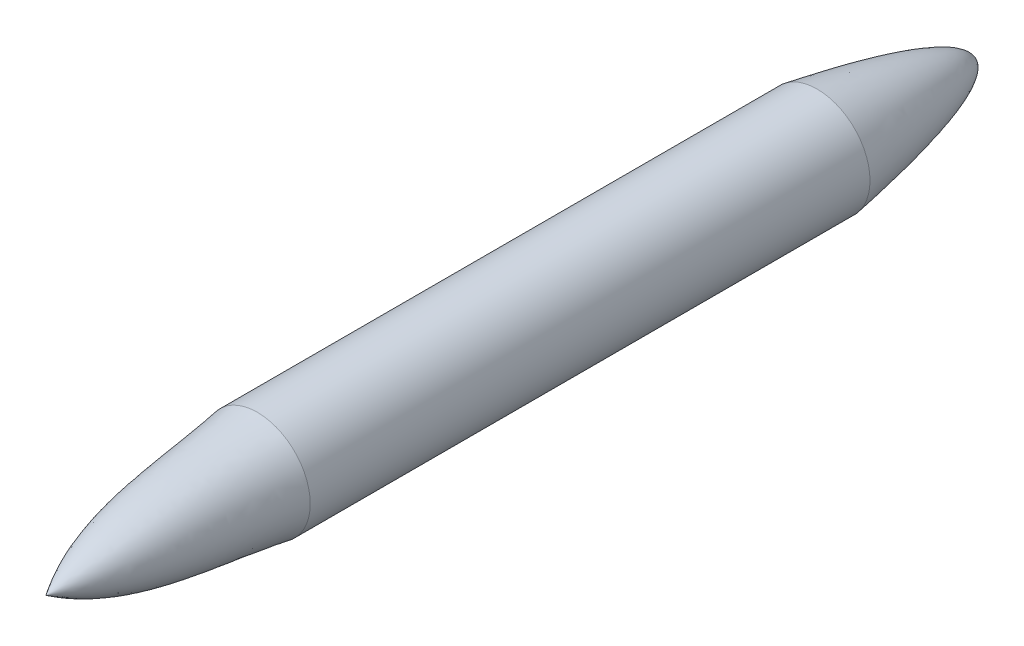
ISO-10303-21;
HEADER;
FILE_DESCRIPTION(('STEP AP214'),'2;1');
FILE_NAME('part.step','',(''),(''),'','','');
FILE_SCHEMA(('AUTOMOTIVE_DESIGN { 1 0 10303 214 1 1 1 1 }'));
ENDSEC;
DATA;
#1=APPLICATION_CONTEXT('core data for automotive mechanical design processes');
#2=APPLICATION_PROTOCOL_DEFINITION('international standard','automotive_design',2000,#1);
#3=PRODUCT_CONTEXT('',#1,'mechanical');
#4=PRODUCT('Part','Part','',(#3));
#5=PRODUCT_RELATED_PRODUCT_CATEGORY('part','',(#4));
#6=PRODUCT_DEFINITION_FORMATION('','',#4);
#7=PRODUCT_DEFINITION_CONTEXT('part definition',#1,'design');
#8=PRODUCT_DEFINITION('design','',#6,#7);
#9=PRODUCT_DEFINITION_SHAPE('','',#8);
#10=(LENGTH_UNIT() NAMED_UNIT(*) SI_UNIT(.MILLI.,.METRE.));
#11=(NAMED_UNIT(*) PLANE_ANGLE_UNIT() SI_UNIT($,.RADIAN.));
#12=(NAMED_UNIT(*) SI_UNIT($,.STERADIAN.) SOLID_ANGLE_UNIT());
#13=UNCERTAINTY_MEASURE_WITH_UNIT(LENGTH_MEASURE(1.E-05),#10,'distance_accuracy_value','');
#14=(GEOMETRIC_REPRESENTATION_CONTEXT(3) GLOBAL_UNCERTAINTY_ASSIGNED_CONTEXT((#13)) GLOBAL_UNIT_ASSIGNED_CONTEXT((#10,
#11,#12)) REPRESENTATION_CONTEXT('',''));
#15=CARTESIAN_POINT('',(0.,0.,0.));
#16=DIRECTION('',(0.,0.,1.));
#17=DIRECTION('',(1.,0.,0.));
#18=AXIS2_PLACEMENT_3D('',#15,#16,#17);
#19=CARTESIAN_POINT('',(9.76480452898376E-13,0.,-17495.52));
#20=CARTESIAN_POINT('',(-996.695999987018,0.,-17495.5199999231));
#21=CARTESIAN_POINT('',(-1993.39200000001,0.,-11595.07968));
#22=B_SPLINE_CURVE_WITH_KNOTS('',2,(#19,#20,#21),.UNSPECIFIED.,.F.,.F.,(3,3),(0.,
0.499999999993487),.UNSPECIFIED.);
#23=CARTESIAN_POINT('',(-1.34825970790097E-12,0.,-17495.52));
#24=DIRECTION('',(0.,0.,1.));
#25=AXIS1_PLACEMENT('',#23,#24);
#26=SURFACE_OF_REVOLUTION('',#22,#25);
#27=CARTESIAN_POINT('',(-1.60926121519527E-12,0.,-11595.07968));
#28=DIRECTION('',(0.,0.,1.));
#29=DIRECTION('',(1.,0.,0.));
#30=AXIS2_PLACEMENT_3D('',#27,#28,#29);
#31=CIRCLE('',#30,1993.392);
#32=CARTESIAN_POINT('',(1993.392,0.,-11595.07968));
#33=VERTEX_POINT('',#32);
#34=EDGE_CURVE('E11',#33,#33,#31,.T.);
#35=ORIENTED_EDGE('',*,*,#34,.F.);
#36=EDGE_LOOP('',(#35));
#37=FACE_BOUND('',#36,.T.);
#38=CARTESIAN_POINT('',(-1.34825970790097E-12,0.,-17495.52));
#39=VERTEX_POINT('',#38);
#40=VERTEX_LOOP('',#39);
#41=FACE_BOUND('',#40,.T.);
#42=ADVANCED_FACE('F36',(#37,#41),#26,.T.);
#43=CARTESIAN_POINT('',(-1.34825970790097E-12,0.,-17495.52));
#44=DIRECTION('',(0.,0.,1.));
#45=DIRECTION('',(1.,0.,0.));
#46=AXIS2_PLACEMENT_3D('',#43,#44,#45);
#47=CYLINDRICAL_SURFACE('',#46,1993.392);
#48=CARTESIAN_POINT('',(-2.54335711298439E-12,0.,9521.952));
#49=DIRECTION('',(0.,0.,1.));
#50=DIRECTION('',(1.,0.,0.));
#51=AXIS2_PLACEMENT_3D('',#48,#49,#50);
#52=CIRCLE('',#51,1993.392);
#53=CARTESIAN_POINT('',(1993.392,0.,9521.952));
#54=VERTEX_POINT('',#53);
#55=EDGE_CURVE('E44',#54,#54,#52,.T.);
#56=ORIENTED_EDGE('',*,*,#55,.F.);
#57=EDGE_LOOP('',(#56));
#58=FACE_BOUND('',#57,.T.);
#59=ORIENTED_EDGE('',*,*,#34,.T.);
#60=EDGE_LOOP('',(#59));
#61=FACE_BOUND('',#60,.T.);
#62=ADVANCED_FACE('F53',(#58,#61),#47,.T.);
#63=CARTESIAN_POINT('',(-1993.392,0.,9521.952));
#64=CARTESIAN_POINT('',(-1540.98996407076,0.,12218.2816316481));
#65=CARTESIAN_POINT('',(-1564.11131680031,0.,15114.5070668162));
#66=CARTESIAN_POINT('',(9.76480452898376E-13,0.,17495.52));
#67=B_SPLINE_CURVE_WITH_KNOTS('',3,(#63,#64,#65,#66),.UNSPECIFIED.,.F.,.F.,(4,4),(0.,1.),.UNSPECIFIED.);
#68=CARTESIAN_POINT('',(-1.34825970790097E-12,0.,-17495.52));
#69=DIRECTION('',(0.,0.,1.));
#70=AXIS1_PLACEMENT('',#68,#69);
#71=SURFACE_OF_REVOLUTION('',#67,#70);
#72=CARTESIAN_POINT('',(2.93690680558273E-12,0.,17495.52));
#73=VERTEX_POINT('',#72);
#74=VERTEX_LOOP('',#73);
#75=FACE_BOUND('',#74,.T.);
#76=ORIENTED_EDGE('',*,*,#55,.T.);
#77=EDGE_LOOP('',(#76));
#78=FACE_BOUND('',#77,.T.);
#79=ADVANCED_FACE('F50',(#75,#78),#71,.T.);
#80=CLOSED_SHELL('',(#42,#62,#79));
#81=MANIFOLD_SOLID_BREP('B2',#80);
#82=ADVANCED_BREP_SHAPE_REPRESENTATION('',(#18,#81),#14);
#83=SHAPE_DEFINITION_REPRESENTATION(#9,#82);
ENDSEC;
END-ISO-10303-21;
